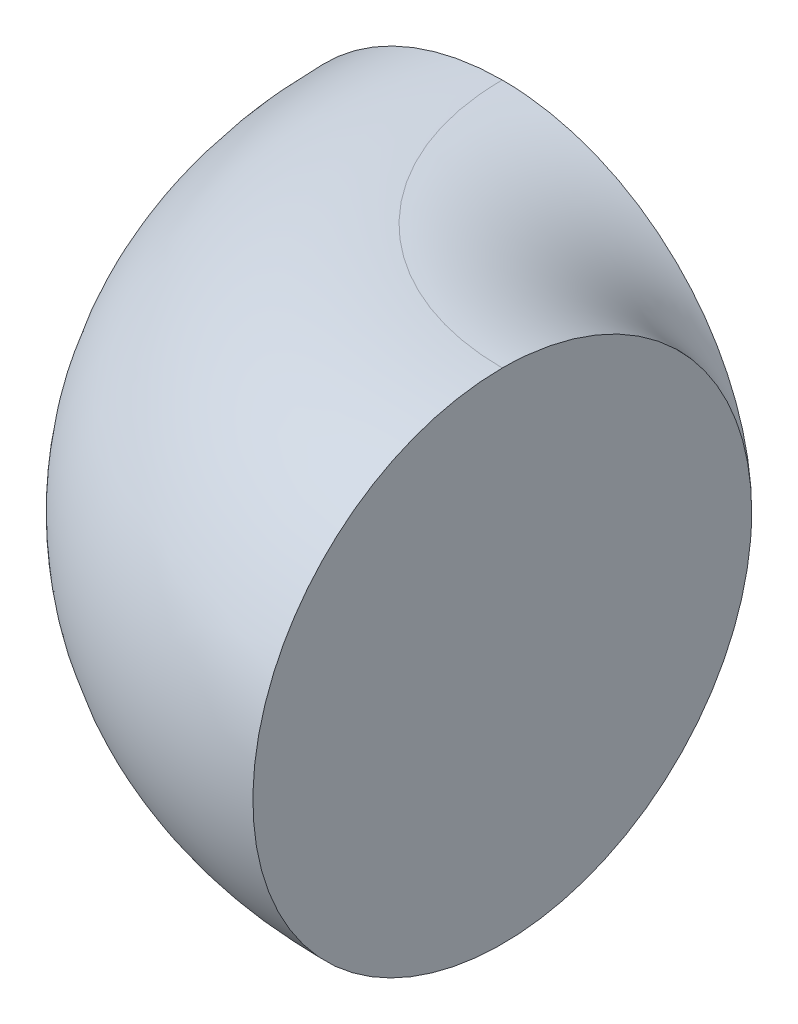
ISO-10303-21;
HEADER;
FILE_DESCRIPTION(('STEP AP214'),'2;1');
FILE_NAME('part.step','',(''),(''),'','','');
FILE_SCHEMA(('AUTOMOTIVE_DESIGN { 1 0 10303 214 1 1 1 1 }'));
ENDSEC;
DATA;
#1=APPLICATION_CONTEXT('core data for automotive mechanical design processes');
#2=APPLICATION_PROTOCOL_DEFINITION('international standard','automotive_design',2000,#1);
#3=PRODUCT_CONTEXT('',#1,'mechanical');
#4=PRODUCT('Part','Part','',(#3));
#5=PRODUCT_RELATED_PRODUCT_CATEGORY('part','',(#4));
#6=PRODUCT_DEFINITION_FORMATION('','',#4);
#7=PRODUCT_DEFINITION_CONTEXT('part definition',#1,'design');
#8=PRODUCT_DEFINITION('design','',#6,#7);
#9=PRODUCT_DEFINITION_SHAPE('','',#8);
#10=(LENGTH_UNIT() NAMED_UNIT(*) SI_UNIT(.MILLI.,.METRE.));
#11=(NAMED_UNIT(*) PLANE_ANGLE_UNIT() SI_UNIT($,.RADIAN.));
#12=(NAMED_UNIT(*) SI_UNIT($,.STERADIAN.) SOLID_ANGLE_UNIT());
#13=UNCERTAINTY_MEASURE_WITH_UNIT(LENGTH_MEASURE(1.E-05),#10,'distance_accuracy_value','');
#14=(GEOMETRIC_REPRESENTATION_CONTEXT(3) GLOBAL_UNCERTAINTY_ASSIGNED_CONTEXT((#13)) GLOBAL_UNIT_ASSIGNED_CONTEXT((#10,
#11,#12)) REPRESENTATION_CONTEXT('',''));
#15=CARTESIAN_POINT('',(0.,0.,0.));
#16=DIRECTION('',(0.,0.,1.));
#17=DIRECTION('',(1.,0.,0.));
#18=AXIS2_PLACEMENT_3D('',#15,#16,#17);
#19=CARTESIAN_POINT('',(-1.9701171875,-0.125,1.971890713943));
#20=CARTESIAN_POINT('',(-1.9701171875,0.125,1.971890713943));
#21=CARTESIAN_POINT('',(-1.7201171875,-0.125,1.971890713943));
#22=CARTESIAN_POINT('',(-1.7201171875,0.125,1.971890713943));
#23=(BOUNDED_SURFACE() B_SPLINE_SURFACE(1,1,((#19,#20),(#21,#22)),.UNSPECIFIED.,.F.,.F.,
.F.) B_SPLINE_SURFACE_WITH_KNOTS((2,2),(2,2),(-0.130582274842,0.119417725158),(-0.130582274842,
0.119417725158),.UNSPECIFIED.) GEOMETRIC_REPRESENTATION_ITEM() RATIONAL_B_SPLINE_SURFACE(((1.,
1.),(1.,1.))) REPRESENTATION_ITEM('') SURFACE());
#24=CARTESIAN_POINT('',(-1.7201171875,0.,1.971890713943));
#25=CARTESIAN_POINT('',(-1.7201171875,0.125,1.971890713943));
#26=CARTESIAN_POINT('',(-1.8451171875,0.125,1.971890713943));
#27=(BOUNDED_CURVE() B_SPLINE_CURVE(2,(#24,#25,#26),.UNSPECIFIED.,.F.,
.F.) B_SPLINE_CURVE_WITH_KNOTS((3,3),(3.14159265359,4.712388980385),
.UNSPECIFIED.) CURVE() GEOMETRIC_REPRESENTATION_ITEM() RATIONAL_B_SPLINE_CURVE((1.,
0.707106781187,1.)) REPRESENTATION_ITEM(''));
#28=CARTESIAN_POINT('',(-1.7201171875,0.,1.971890713943));
#29=VERTEX_POINT('',#28);
#30=CARTESIAN_POINT('',(-1.8451171875,0.125,1.971890713943));
#31=VERTEX_POINT('',#30);
#32=EDGE_CURVE('E31',#29,#31,#27,.T.);
#33=CARTESIAN_POINT('',(-1.8451171875,0.125,1.971890713943));
#34=CARTESIAN_POINT('',(-2.146893882797,0.125,1.971890713943));
#35=CARTESIAN_POINT('',(-1.933505535148,-0.08838834764832,1.971890713943));
#36=CARTESIAN_POINT('',(-1.7201171875,-0.301776695297,1.971890713943));
#37=CARTESIAN_POINT('',(-1.7201171875,0.,1.971890713943));
#38=(BOUNDED_CURVE() B_SPLINE_CURVE(2,(#33,#34,#35,#36,#37),.UNSPECIFIED.,.F.,
.F.) B_SPLINE_CURVE_WITH_KNOTS((3,2,3),(4.712388980385,7.068583470577,9.424777960769),
.UNSPECIFIED.) CURVE() GEOMETRIC_REPRESENTATION_ITEM() RATIONAL_B_SPLINE_CURVE((1.,
0.382683432365,1.,0.382683432365,1.)) REPRESENTATION_ITEM(''));
#39=EDGE_CURVE('E58',#31,#29,#38,.T.);
#40=ORIENTED_EDGE('',*,*,#32,.F.);
#41=ORIENTED_EDGE('',*,*,#39,.F.);
#42=EDGE_LOOP('',(#40,#41));
#43=FACE_BOUND('',#42,.T.);
#44=ADVANCED_FACE('F17',(#43),#23,.F.);
#45=CARTESIAN_POINT('',(-1.7201171875,0.125,1.971890713943));
#46=CARTESIAN_POINT('',(-1.7201171875,-0.125,1.971890713943));
#47=CARTESIAN_POINT('',(-1.7201171875,0.125,2.221890713943));
#48=CARTESIAN_POINT('',(-1.7201171875,-0.125,2.221890713943));
#49=(BOUNDED_SURFACE() B_SPLINE_SURFACE(1,1,((#45,#46),(#47,#48)),.UNSPECIFIED.,.F.,.F.,
.F.) B_SPLINE_SURFACE_WITH_KNOTS((2,2),(2,2),(-0.119417725158,0.130582274842),(-0.119417725158,
0.130582274842),.UNSPECIFIED.) GEOMETRIC_REPRESENTATION_ITEM() RATIONAL_B_SPLINE_SURFACE(((1.,
1.),(1.,1.))) REPRESENTATION_ITEM('') SURFACE());
#50=CARTESIAN_POINT('',(-1.7201171875,0.125,2.096890713943));
#51=CARTESIAN_POINT('',(-1.7201171875,0.125,2.39866740924));
#52=CARTESIAN_POINT('',(-1.7201171875,-0.08838834764832,2.185279061591));
#53=CARTESIAN_POINT('',(-1.7201171875,-0.301776695297,1.971890713943));
#54=CARTESIAN_POINT('',(-1.7201171875,0.,1.971890713943));
#55=(BOUNDED_CURVE() B_SPLINE_CURVE(2,(#50,#51,#52,#53,#54),.UNSPECIFIED.,.F.,
.F.) B_SPLINE_CURVE_WITH_KNOTS((3,2,3),(4.712388980385,7.068583470577,9.424777960769),
.UNSPECIFIED.) CURVE() GEOMETRIC_REPRESENTATION_ITEM() RATIONAL_B_SPLINE_CURVE((1.,
0.382683432365,1.,0.382683432365,1.)) REPRESENTATION_ITEM(''));
#56=CARTESIAN_POINT('',(-1.7201171875,0.125,2.096890713943));
#57=VERTEX_POINT('',#56);
#58=EDGE_CURVE('E52',#57,#29,#55,.T.);
#59=CARTESIAN_POINT('',(-1.7201171875,0.,1.971890713943));
#60=CARTESIAN_POINT('',(-1.7201171875,0.125,1.971890713943));
#61=CARTESIAN_POINT('',(-1.7201171875,0.125,2.096890713943));
#62=(BOUNDED_CURVE() B_SPLINE_CURVE(2,(#59,#60,#61),.UNSPECIFIED.,.F.,
.F.) B_SPLINE_CURVE_WITH_KNOTS((3,3),(3.14159265359,4.712388980385),
.UNSPECIFIED.) CURVE() GEOMETRIC_REPRESENTATION_ITEM() RATIONAL_B_SPLINE_CURVE((1.,
0.707106781187,1.)) REPRESENTATION_ITEM(''));
#63=EDGE_CURVE('E11',#29,#57,#62,.T.);
#64=ORIENTED_EDGE('',*,*,#58,.T.);
#65=ORIENTED_EDGE('',*,*,#63,.T.);
#66=EDGE_LOOP('',(#64,#65));
#67=FACE_BOUND('',#66,.T.);
#68=ADVANCED_FACE('F19',(#67),#49,.T.);
#69=CARTESIAN_POINT('',(-1.7201171875,0.,1.971890713943));
#70=CARTESIAN_POINT('',(-1.7201171875,0.125,1.971890713943));
#71=CARTESIAN_POINT('',(-1.7201171875,0.125,2.096890713943));
#72=CARTESIAN_POINT('',(-1.7201171875,0.,1.971890713943));
#73=CARTESIAN_POINT('',(-1.7201171875,0.125,1.971890713943));
#74=CARTESIAN_POINT('',(-1.8451171875,0.125,2.096890713943));
#75=CARTESIAN_POINT('',(-1.7201171875,0.,1.971890713943));
#76=CARTESIAN_POINT('',(-1.7201171875,0.125,1.971890713943));
#77=CARTESIAN_POINT('',(-1.8451171875,0.125,1.971890713943));
#78=(BOUNDED_SURFACE() B_SPLINE_SURFACE(2,2,((#69,#70,#71),(#72,#73,#74),(#75,#76,#77)),
.UNSPECIFIED.,.F.,.F.,.F.) B_SPLINE_SURFACE_WITH_KNOTS((3,3),(3,3),(1.570796326795,
3.14159265359),(3.14159265359,4.712388980385),
.UNSPECIFIED.) GEOMETRIC_REPRESENTATION_ITEM() RATIONAL_B_SPLINE_SURFACE(((1.,0.707106781186,
1.),(0.707106781187,0.5,0.707106781187),(1.,0.707106781186,1.))) REPRESENTATION_ITEM('') SURFACE());
#79=CARTESIAN_POINT('',(-1.7201171875,0.125,2.096890713943));
#80=CARTESIAN_POINT('',(-1.8451171875,0.125,2.096890713943));
#81=CARTESIAN_POINT('',(-1.8451171875,0.125,1.971890713943));
#82=(BOUNDED_CURVE() B_SPLINE_CURVE(2,(#79,#80,#81),.UNSPECIFIED.,.F.,
.F.) B_SPLINE_CURVE_WITH_KNOTS((3,3),(1.570796326795,3.14159265359),
.UNSPECIFIED.) CURVE() GEOMETRIC_REPRESENTATION_ITEM() RATIONAL_B_SPLINE_CURVE((1.,
0.707106781187,1.)) REPRESENTATION_ITEM(''));
#83=EDGE_CURVE('E57',#57,#31,#82,.T.);
#84=ORIENTED_EDGE('',*,*,#32,.T.);
#85=ORIENTED_EDGE('',*,*,#83,.F.);
#86=ORIENTED_EDGE('',*,*,#63,.F.);
#87=EDGE_LOOP('',(#84,#85,#86));
#88=FACE_BOUND('',#87,.T.);
#89=ADVANCED_FACE('F61',(#88),#78,.T.);
#90=CARTESIAN_POINT('',(-1.7201171875,0.125,2.096890713943));
#91=CARTESIAN_POINT('',(-1.7201171875,0.125,2.39866740924));
#92=CARTESIAN_POINT('',(-1.7201171875,-0.08838834764832,2.185279061591));
#93=CARTESIAN_POINT('',(-1.7201171875,-0.301776695297,1.971890713943));
#94=CARTESIAN_POINT('',(-1.7201171875,0.,1.971890713943));
#95=CARTESIAN_POINT('',(-1.8451171875,0.125,2.096890713943));
#96=CARTESIAN_POINT('',(-2.146893882797,0.125,2.39866740924));
#97=CARTESIAN_POINT('',(-1.933505535148,-0.08838834764832,2.185279061591));
#98=CARTESIAN_POINT('',(-1.7201171875,-0.301776695297,1.971890713943));
#99=CARTESIAN_POINT('',(-1.7201171875,0.,1.971890713943));
#100=CARTESIAN_POINT('',(-1.8451171875,0.125,1.971890713943));
#101=CARTESIAN_POINT('',(-2.146893882797,0.125,1.971890713943));
#102=CARTESIAN_POINT('',(-1.933505535148,-0.08838834764832,1.971890713943));
#103=CARTESIAN_POINT('',(-1.7201171875,-0.301776695297,1.971890713943));
#104=CARTESIAN_POINT('',(-1.7201171875,0.,1.971890713943));
#105=(BOUNDED_SURFACE() B_SPLINE_SURFACE(2,2,((#90,#91,#92,#93,#94),(#95,#96,#97,#98,#99),(#100,
#101,#102,#103,#104)),.UNSPECIFIED.,.F.,.F.,.F.) B_SPLINE_SURFACE_WITH_KNOTS((3,3),(3,2,3),
(1.570796326795,3.14159265359),(-1.570796326795,0.785398163397,3.14159265359),
.UNSPECIFIED.) GEOMETRIC_REPRESENTATION_ITEM() RATIONAL_B_SPLINE_SURFACE(((1.,0.382683432365,1.,
0.382683432365,1.),(0.707106781186,0.270598050073,0.707106781186,0.270598050073,0.707106781186),
(1.,0.382683432365,1.,0.382683432365,1.))) REPRESENTATION_ITEM('') SURFACE());
#106=ORIENTED_EDGE('',*,*,#83,.T.);
#107=ORIENTED_EDGE('',*,*,#39,.T.);
#108=ORIENTED_EDGE('',*,*,#58,.F.);
#109=EDGE_LOOP('',(#106,#107,#108));
#110=FACE_BOUND('',#109,.T.);
#111=ADVANCED_FACE('F56',(#110),#105,.T.);
#112=CLOSED_SHELL('',(#44,#68,#89,#111));
#113=MANIFOLD_SOLID_BREP('B1',#112);
#114=ADVANCED_BREP_SHAPE_REPRESENTATION('',(#18,#113),#14);
#115=SHAPE_DEFINITION_REPRESENTATION(#9,#114);
ENDSEC;
END-ISO-10303-21;
